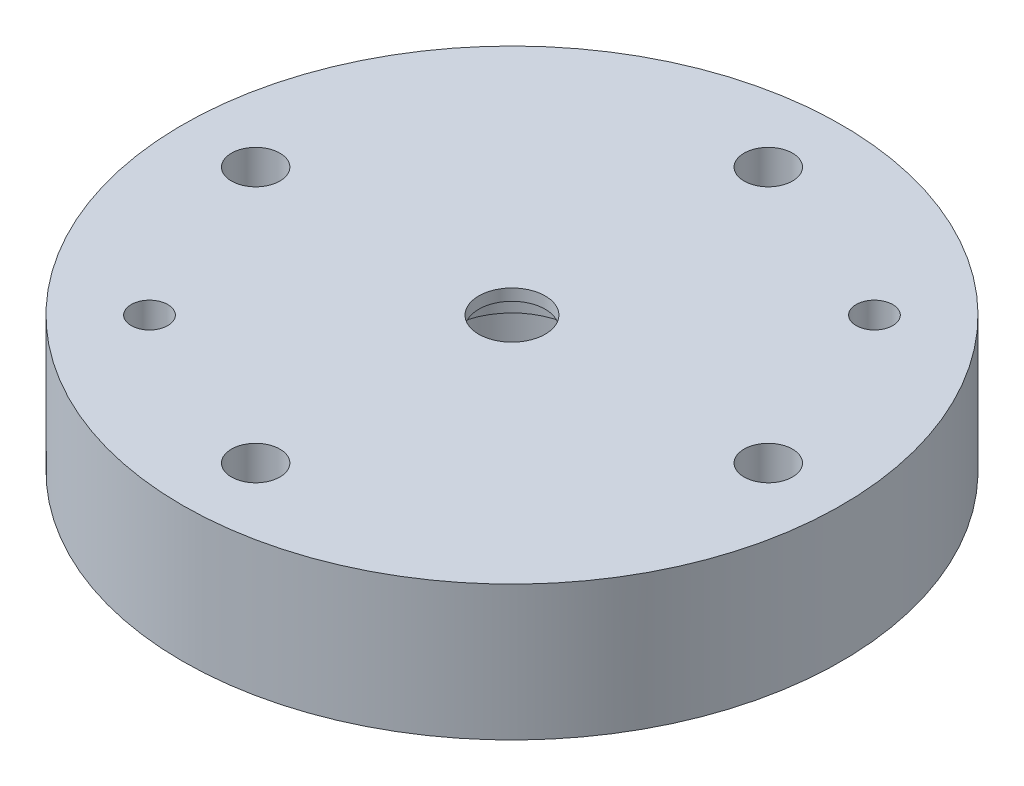
ISO-10303-21;
HEADER;
FILE_DESCRIPTION(('STEP AP214'),'2;1');
FILE_NAME('part.step','',(''),(''),'','','');
FILE_SCHEMA(('AUTOMOTIVE_DESIGN { 1 0 10303 214 1 1 1 1 }'));
ENDSEC;
DATA;
#1=APPLICATION_CONTEXT('core data for automotive mechanical design processes');
#2=APPLICATION_PROTOCOL_DEFINITION('international standard','automotive_design',2000,#1);
#3=PRODUCT_CONTEXT('',#1,'mechanical');
#4=PRODUCT('Part','Part','',(#3));
#5=PRODUCT_RELATED_PRODUCT_CATEGORY('part','',(#4));
#6=PRODUCT_DEFINITION_FORMATION('','',#4);
#7=PRODUCT_DEFINITION_CONTEXT('part definition',#1,'design');
#8=PRODUCT_DEFINITION('design','',#6,#7);
#9=PRODUCT_DEFINITION_SHAPE('','',#8);
#10=(LENGTH_UNIT() NAMED_UNIT(*) SI_UNIT(.MILLI.,.METRE.));
#11=(NAMED_UNIT(*) PLANE_ANGLE_UNIT() SI_UNIT($,.RADIAN.));
#12=(NAMED_UNIT(*) SI_UNIT($,.STERADIAN.) SOLID_ANGLE_UNIT());
#13=UNCERTAINTY_MEASURE_WITH_UNIT(LENGTH_MEASURE(1.E-05),#10,'distance_accuracy_value','');
#14=(GEOMETRIC_REPRESENTATION_CONTEXT(3) GLOBAL_UNCERTAINTY_ASSIGNED_CONTEXT((#13)) GLOBAL_UNIT_ASSIGNED_CONTEXT((#10,
#11,#12)) REPRESENTATION_CONTEXT('',''));
#15=CARTESIAN_POINT('',(0.,0.,0.));
#16=DIRECTION('',(0.,0.,1.));
#17=DIRECTION('',(1.,0.,0.));
#18=AXIS2_PLACEMENT_3D('',#15,#16,#17);
#19=CARTESIAN_POINT('',(0.,-5.5372,0.));
#20=DIRECTION('',(0.,1.,0.));
#21=DIRECTION('',(0.,0.,1.));
#22=AXIS2_PLACEMENT_3D('',#19,#20,#21);
#23=CYLINDRICAL_SURFACE('',#22,57.15);
#24=CARTESIAN_POINT('',(0.,-21.4122,0.));
#25=DIRECTION('',(0.,-1.,0.));
#26=DIRECTION('',(0.,0.,-1.));
#27=AXIS2_PLACEMENT_3D('',#24,#25,#26);
#28=CIRCLE('',#27,57.15);
#29=CARTESIAN_POINT('',(0.,-21.4122,-57.15));
#30=VERTEX_POINT('',#29);
#31=EDGE_CURVE('E12',#30,#30,#28,.T.);
#32=ORIENTED_EDGE('',*,*,#31,.F.);
#33=EDGE_LOOP('',(#32));
#34=FACE_BOUND('',#33,.T.);
#35=CARTESIAN_POINT('',(0.,2.,0.));
#36=DIRECTION('',(0.,1.,0.));
#37=DIRECTION('',(0.,0.,1.));
#38=AXIS2_PLACEMENT_3D('',#35,#36,#37);
#39=CIRCLE('',#38,57.15);
#40=CARTESIAN_POINT('',(0.,2.,57.15));
#41=VERTEX_POINT('',#40);
#42=EDGE_CURVE('E48',#41,#41,#39,.T.);
#43=ORIENTED_EDGE('',*,*,#42,.F.);
#44=EDGE_LOOP('',(#43));
#45=FACE_BOUND('',#44,.T.);
#46=ADVANCED_FACE('F42',(#34,#45),#23,.T.);
#47=CARTESIAN_POINT('',(0.,-21.4122,0.));
#48=DIRECTION('',(0.,-1.,0.));
#49=DIRECTION('',(0.,0.,-1.));
#50=AXIS2_PLACEMENT_3D('',#47,#48,#49);
#51=PLANE('',#50);
#52=CARTESIAN_POINT('',(0.,-21.4122,0.));
#53=DIRECTION('',(0.,-1.,0.));
#54=DIRECTION('',(0.,0.,-1.));
#55=AXIS2_PLACEMENT_3D('',#52,#53,#54);
#56=CIRCLE('',#55,12.7);
#57=CARTESIAN_POINT('',(0.,-21.4122,-12.7));
#58=VERTEX_POINT('',#57);
#59=EDGE_CURVE('E106',#58,#58,#56,.T.);
#60=ORIENTED_EDGE('',*,*,#59,.F.);
#61=EDGE_LOOP('',(#60));
#62=FACE_BOUND('',#61,.T.);
#63=CARTESIAN_POINT('',(31.430896423742,-21.4122,-31.4308964237421));
#64=DIRECTION('',(0.,1.,0.));
#65=DIRECTION('',(0.,0.,1.));
#66=AXIS2_PLACEMENT_3D('',#63,#64,#65);
#67=CIRCLE('',#66,3.175);
#68=CARTESIAN_POINT('',(31.430896423742,-21.4122,-28.2558964237421));
#69=VERTEX_POINT('',#68);
#70=EDGE_CURVE('E94',#69,#69,#67,.T.);
#71=ORIENTED_EDGE('',*,*,#70,.T.);
#72=EDGE_LOOP('',(#71));
#73=FACE_BOUND('',#72,.T.);
#74=CARTESIAN_POINT('',(-31.430896423742,-21.4122,31.4308964237421));
#75=DIRECTION('',(0.,1.,0.));
#76=DIRECTION('',(0.,0.,1.));
#77=AXIS2_PLACEMENT_3D('',#74,#75,#76);
#78=CIRCLE('',#77,3.17499999999999);
#79=CARTESIAN_POINT('',(-31.430896423742,-21.4122,34.6058964237421));
#80=VERTEX_POINT('',#79);
#81=EDGE_CURVE('E88',#80,#80,#78,.T.);
#82=ORIENTED_EDGE('',*,*,#81,.T.);
#83=EDGE_LOOP('',(#82));
#84=FACE_BOUND('',#83,.T.);
#85=CARTESIAN_POINT('',(-44.45,-21.4122,0.));
#86=DIRECTION('',(0.,1.,0.));
#87=DIRECTION('',(0.,0.,1.));
#88=AXIS2_PLACEMENT_3D('',#85,#86,#87);
#89=CIRCLE('',#88,4.2);
#90=CARTESIAN_POINT('',(-44.45,-21.4122,4.2));
#91=VERTEX_POINT('',#90);
#92=EDGE_CURVE('E82',#91,#91,#89,.T.);
#93=ORIENTED_EDGE('',*,*,#92,.T.);
#94=EDGE_LOOP('',(#93));
#95=FACE_BOUND('',#94,.T.);
#96=CARTESIAN_POINT('',(0.,-21.4122,-44.45));
#97=DIRECTION('',(0.,1.,0.));
#98=DIRECTION('',(0.,0.,1.));
#99=AXIS2_PLACEMENT_3D('',#96,#97,#98);
#100=CIRCLE('',#99,4.2);
#101=CARTESIAN_POINT('',(0.,-21.4122,-40.25));
#102=VERTEX_POINT('',#101);
#103=EDGE_CURVE('E76',#102,#102,#100,.T.);
#104=ORIENTED_EDGE('',*,*,#103,.T.);
#105=EDGE_LOOP('',(#104));
#106=FACE_BOUND('',#105,.T.);
#107=CARTESIAN_POINT('',(44.45,-21.4122,0.));
#108=DIRECTION('',(0.,1.,0.));
#109=DIRECTION('',(0.,0.,1.));
#110=AXIS2_PLACEMENT_3D('',#107,#108,#109);
#111=CIRCLE('',#110,4.2);
#112=CARTESIAN_POINT('',(44.45,-21.4122,4.2));
#113=VERTEX_POINT('',#112);
#114=EDGE_CURVE('E70',#113,#113,#111,.T.);
#115=ORIENTED_EDGE('',*,*,#114,.T.);
#116=EDGE_LOOP('',(#115));
#117=FACE_BOUND('',#116,.T.);
#118=CARTESIAN_POINT('',(0.,-21.4122,44.45));
#119=DIRECTION('',(0.,1.,0.));
#120=DIRECTION('',(0.,0.,1.));
#121=AXIS2_PLACEMENT_3D('',#118,#119,#120);
#122=CIRCLE('',#121,4.2);
#123=CARTESIAN_POINT('',(0.,-21.4122,48.65));
#124=VERTEX_POINT('',#123);
#125=EDGE_CURVE('E64',#124,#124,#122,.T.);
#126=ORIENTED_EDGE('',*,*,#125,.T.);
#127=EDGE_LOOP('',(#126));
#128=FACE_BOUND('',#127,.T.);
#129=ORIENTED_EDGE('',*,*,#31,.T.);
#130=EDGE_LOOP('',(#129));
#131=FACE_BOUND('',#130,.T.);
#132=ADVANCED_FACE('F113',(#62,#73,#84,#95,#106,#117,#128,#131),#51,.T.);
#133=CARTESIAN_POINT('',(0.,2.,0.));
#134=DIRECTION('',(0.,1.,0.));
#135=DIRECTION('',(0.,0.,1.));
#136=AXIS2_PLACEMENT_3D('',#133,#134,#135);
#137=PLANE('',#136);
#138=CARTESIAN_POINT('',(31.430896423742,2.,-31.4308964237421));
#139=DIRECTION('',(0.,1.,0.));
#140=DIRECTION('',(0.,0.,1.));
#141=AXIS2_PLACEMENT_3D('',#138,#139,#140);
#142=CIRCLE('',#141,3.175);
#143=CARTESIAN_POINT('',(31.430896423742,2.,-28.2558964237421));
#144=VERTEX_POINT('',#143);
#145=EDGE_CURVE('E97',#144,#144,#142,.T.);
#146=ORIENTED_EDGE('',*,*,#145,.F.);
#147=EDGE_LOOP('',(#146));
#148=FACE_BOUND('',#147,.T.);
#149=CARTESIAN_POINT('',(-31.430896423742,2.,31.4308964237421));
#150=DIRECTION('',(0.,1.,0.));
#151=DIRECTION('',(0.,0.,1.));
#152=AXIS2_PLACEMENT_3D('',#149,#150,#151);
#153=CIRCLE('',#152,3.175);
#154=CARTESIAN_POINT('',(-31.430896423742,2.,34.6058964237421));
#155=VERTEX_POINT('',#154);
#156=EDGE_CURVE('E91',#155,#155,#153,.T.);
#157=ORIENTED_EDGE('',*,*,#156,.F.);
#158=EDGE_LOOP('',(#157));
#159=FACE_BOUND('',#158,.T.);
#160=CARTESIAN_POINT('',(-44.45,2.,0.));
#161=DIRECTION('',(0.,1.,0.));
#162=DIRECTION('',(0.,0.,1.));
#163=AXIS2_PLACEMENT_3D('',#160,#161,#162);
#164=CIRCLE('',#163,4.2);
#165=CARTESIAN_POINT('',(-44.45,2.,4.2));
#166=VERTEX_POINT('',#165);
#167=EDGE_CURVE('E85',#166,#166,#164,.T.);
#168=ORIENTED_EDGE('',*,*,#167,.F.);
#169=EDGE_LOOP('',(#168));
#170=FACE_BOUND('',#169,.T.);
#171=CARTESIAN_POINT('',(0.,2.,-44.45));
#172=DIRECTION('',(0.,1.,0.));
#173=DIRECTION('',(0.,0.,1.));
#174=AXIS2_PLACEMENT_3D('',#171,#172,#173);
#175=CIRCLE('',#174,4.2);
#176=CARTESIAN_POINT('',(0.,2.,-40.25));
#177=VERTEX_POINT('',#176);
#178=EDGE_CURVE('E79',#177,#177,#175,.T.);
#179=ORIENTED_EDGE('',*,*,#178,.F.);
#180=EDGE_LOOP('',(#179));
#181=FACE_BOUND('',#180,.T.);
#182=CARTESIAN_POINT('',(44.45,2.,0.));
#183=DIRECTION('',(0.,1.,0.));
#184=DIRECTION('',(0.,0.,1.));
#185=AXIS2_PLACEMENT_3D('',#182,#183,#184);
#186=CIRCLE('',#185,4.2);
#187=CARTESIAN_POINT('',(44.45,2.,4.2));
#188=VERTEX_POINT('',#187);
#189=EDGE_CURVE('E73',#188,#188,#186,.T.);
#190=ORIENTED_EDGE('',*,*,#189,.F.);
#191=EDGE_LOOP('',(#190));
#192=FACE_BOUND('',#191,.T.);
#193=CARTESIAN_POINT('',(0.,2.,44.45));
#194=DIRECTION('',(0.,1.,0.));
#195=DIRECTION('',(0.,0.,1.));
#196=AXIS2_PLACEMENT_3D('',#193,#194,#195);
#197=CIRCLE('',#196,4.2);
#198=CARTESIAN_POINT('',(0.,2.,48.65));
#199=VERTEX_POINT('',#198);
#200=EDGE_CURVE('E67',#199,#199,#197,.T.);
#201=ORIENTED_EDGE('',*,*,#200,.F.);
#202=EDGE_LOOP('',(#201));
#203=FACE_BOUND('',#202,.T.);
#204=CARTESIAN_POINT('',(0.,2.,0.));
#205=DIRECTION('',(0.,1.,0.));
#206=DIRECTION('',(0.,0.,1.));
#207=AXIS2_PLACEMENT_3D('',#204,#205,#206);
#208=CIRCLE('',#207,5.7625);
#209=CARTESIAN_POINT('',(0.,2.,5.7625));
#210=VERTEX_POINT('',#209);
#211=EDGE_CURVE('E56',#210,#210,#208,.T.);
#212=ORIENTED_EDGE('',*,*,#211,.F.);
#213=EDGE_LOOP('',(#212));
#214=FACE_BOUND('',#213,.T.);
#215=ORIENTED_EDGE('',*,*,#42,.T.);
#216=EDGE_LOOP('',(#215));
#217=FACE_BOUND('',#216,.T.);
#218=ADVANCED_FACE('F116',(#148,#159,#170,#181,#192,#203,#214,#217),#137,.T.);
#219=CARTESIAN_POINT('',(0.,18.2988113063499,0.));
#220=DIRECTION('',(0.,-1.,0.));
#221=DIRECTION('',(0.,0.,-1.));
#222=AXIS2_PLACEMENT_3D('',#219,#220,#221);
#223=CYLINDRICAL_SURFACE('',#222,5.7625);
#224=CARTESIAN_POINT('',(0.,0.,0.));
#225=DIRECTION('',(0.,1.,0.));
#226=DIRECTION('',(0.,0.,1.));
#227=AXIS2_PLACEMENT_3D('',#224,#225,#226);
#228=CIRCLE('',#227,5.7625);
#229=CARTESIAN_POINT('',(0.,0.,5.7625));
#230=VERTEX_POINT('',#229);
#231=EDGE_CURVE('E61',#230,#230,#228,.T.);
#232=ORIENTED_EDGE('',*,*,#231,.F.);
#233=EDGE_LOOP('',(#232));
#234=FACE_BOUND('',#233,.T.);
#235=ORIENTED_EDGE('',*,*,#211,.T.);
#236=EDGE_LOOP('',(#235));
#237=FACE_BOUND('',#236,.T.);
#238=ADVANCED_FACE('F139',(#234,#237),#223,.F.);
#239=CARTESIAN_POINT('',(0.,-5.5372,0.));
#240=DIRECTION('',(0.,1.,0.));
#241=DIRECTION('',(0.,0.,1.));
#242=AXIS2_PLACEMENT_3D('',#239,#240,#241);
#243=CYLINDRICAL_SURFACE('',#242,11.1125);
#244=CARTESIAN_POINT('',(0.,-5.5372,0.));
#245=DIRECTION('',(0.,1.,0.));
#246=DIRECTION('',(0.,0.,1.));
#247=AXIS2_PLACEMENT_3D('',#244,#245,#246);
#248=CIRCLE('',#247,11.1125);
#249=CARTESIAN_POINT('',(0.,-5.5372,11.1125));
#250=VERTEX_POINT('',#249);
#251=EDGE_CURVE('E100',#250,#250,#248,.F.);
#252=ORIENTED_EDGE('',*,*,#251,.T.);
#253=EDGE_LOOP('',(#252));
#254=FACE_BOUND('',#253,.T.);
#255=CARTESIAN_POINT('',(0.,0.,0.));
#256=DIRECTION('',(0.,1.,0.));
#257=DIRECTION('',(0.,0.,1.));
#258=AXIS2_PLACEMENT_3D('',#255,#256,#257);
#259=CIRCLE('',#258,11.1125);
#260=CARTESIAN_POINT('',(0.,0.,11.1125));
#261=VERTEX_POINT('',#260);
#262=EDGE_CURVE('E52',#261,#261,#259,.T.);
#263=ORIENTED_EDGE('',*,*,#262,.T.);
#264=EDGE_LOOP('',(#263));
#265=FACE_BOUND('',#264,.T.);
#266=ADVANCED_FACE('F145',(#254,#265),#243,.F.);
#267=CARTESIAN_POINT('',(0.,0.,0.));
#268=DIRECTION('',(0.,1.,0.));
#269=DIRECTION('',(0.,0.,1.));
#270=AXIS2_PLACEMENT_3D('',#267,#268,#269);
#271=PLANE('',#270);
#272=ORIENTED_EDGE('',*,*,#231,.T.);
#273=EDGE_LOOP('',(#272));
#274=FACE_BOUND('',#273,.T.);
#275=ORIENTED_EDGE('',*,*,#262,.F.);
#276=EDGE_LOOP('',(#275));
#277=FACE_BOUND('',#276,.T.);
#278=ADVANCED_FACE('F133',(#274,#277),#271,.F.);
#279=CARTESIAN_POINT('',(0.,2.,44.45));
#280=DIRECTION('',(0.,1.,0.));
#281=DIRECTION('',(0.,0.,1.));
#282=AXIS2_PLACEMENT_3D('',#279,#280,#281);
#283=CYLINDRICAL_SURFACE('',#282,4.2);
#284=ORIENTED_EDGE('',*,*,#125,.F.);
#285=EDGE_LOOP('',(#284));
#286=FACE_BOUND('',#285,.T.);
#287=ORIENTED_EDGE('',*,*,#200,.T.);
#288=EDGE_LOOP('',(#287));
#289=FACE_BOUND('',#288,.T.);
#290=ADVANCED_FACE('F129',(#286,#289),#283,.F.);
#291=CARTESIAN_POINT('',(44.45,2.,0.));
#292=DIRECTION('',(0.,1.,0.));
#293=DIRECTION('',(0.,0.,1.));
#294=AXIS2_PLACEMENT_3D('',#291,#292,#293);
#295=CYLINDRICAL_SURFACE('',#294,4.2);
#296=ORIENTED_EDGE('',*,*,#114,.F.);
#297=EDGE_LOOP('',(#296));
#298=FACE_BOUND('',#297,.T.);
#299=ORIENTED_EDGE('',*,*,#189,.T.);
#300=EDGE_LOOP('',(#299));
#301=FACE_BOUND('',#300,.T.);
#302=ADVANCED_FACE('F132',(#298,#301),#295,.F.);
#303=CARTESIAN_POINT('',(0.,2.,-44.45));
#304=DIRECTION('',(0.,1.,0.));
#305=DIRECTION('',(0.,0.,1.));
#306=AXIS2_PLACEMENT_3D('',#303,#304,#305);
#307=CYLINDRICAL_SURFACE('',#306,4.2);
#308=ORIENTED_EDGE('',*,*,#103,.F.);
#309=EDGE_LOOP('',(#308));
#310=FACE_BOUND('',#309,.T.);
#311=ORIENTED_EDGE('',*,*,#178,.T.);
#312=EDGE_LOOP('',(#311));
#313=FACE_BOUND('',#312,.T.);
#314=ADVANCED_FACE('F220',(#310,#313),#307,.F.);
#315=CARTESIAN_POINT('',(-44.45,2.,0.));
#316=DIRECTION('',(0.,1.,0.));
#317=DIRECTION('',(0.,0.,1.));
#318=AXIS2_PLACEMENT_3D('',#315,#316,#317);
#319=CYLINDRICAL_SURFACE('',#318,4.2);
#320=ORIENTED_EDGE('',*,*,#92,.F.);
#321=EDGE_LOOP('',(#320));
#322=FACE_BOUND('',#321,.T.);
#323=ORIENTED_EDGE('',*,*,#167,.T.);
#324=EDGE_LOOP('',(#323));
#325=FACE_BOUND('',#324,.T.);
#326=ADVANCED_FACE('F178',(#322,#325),#319,.F.);
#327=CARTESIAN_POINT('',(-31.430896423742,2.,31.4308964237421));
#328=DIRECTION('',(0.,1.,0.));
#329=DIRECTION('',(0.,0.,1.));
#330=AXIS2_PLACEMENT_3D('',#327,#328,#329);
#331=CYLINDRICAL_SURFACE('',#330,3.175);
#332=ORIENTED_EDGE('',*,*,#81,.F.);
#333=EDGE_LOOP('',(#332));
#334=FACE_BOUND('',#333,.T.);
#335=ORIENTED_EDGE('',*,*,#156,.T.);
#336=EDGE_LOOP('',(#335));
#337=FACE_BOUND('',#336,.T.);
#338=ADVANCED_FACE('F183',(#334,#337),#331,.F.);
#339=CARTESIAN_POINT('',(31.430896423742,2.,-31.4308964237421));
#340=DIRECTION('',(0.,1.,0.));
#341=DIRECTION('',(0.,0.,1.));
#342=AXIS2_PLACEMENT_3D('',#339,#340,#341);
#343=CYLINDRICAL_SURFACE('',#342,3.175);
#344=ORIENTED_EDGE('',*,*,#70,.F.);
#345=EDGE_LOOP('',(#344));
#346=FACE_BOUND('',#345,.T.);
#347=ORIENTED_EDGE('',*,*,#145,.T.);
#348=EDGE_LOOP('',(#347));
#349=FACE_BOUND('',#348,.T.);
#350=ADVANCED_FACE('F187',(#346,#349),#343,.F.);
#351=CARTESIAN_POINT('',(0.,-5.5372,0.));
#352=DIRECTION('',(0.,1.,0.));
#353=DIRECTION('',(0.,0.,1.));
#354=AXIS2_PLACEMENT_3D('',#351,#352,#353);
#355=PLANE('',#354);
#356=CARTESIAN_POINT('',(0.,-5.5372,0.));
#357=DIRECTION('',(0.,1.,0.));
#358=DIRECTION('',(0.,0.,1.));
#359=AXIS2_PLACEMENT_3D('',#356,#357,#358);
#360=CIRCLE('',#359,12.7);
#361=CARTESIAN_POINT('',(0.,-5.53720000000001,-12.7));
#362=VERTEX_POINT('',#361);
#363=EDGE_CURVE('E103',#362,#362,#360,.F.);
#364=ORIENTED_EDGE('',*,*,#363,.T.);
#365=EDGE_LOOP('',(#364));
#366=FACE_BOUND('',#365,.T.);
#367=ORIENTED_EDGE('',*,*,#251,.F.);
#368=EDGE_LOOP('',(#367));
#369=FACE_BOUND('',#368,.T.);
#370=ADVANCED_FACE('F196',(#366,#369),#355,.F.);
#371=CARTESIAN_POINT('',(0.,30.3838244842766,0.));
#372=DIRECTION('',(0.,-1.,0.));
#373=DIRECTION('',(0.,0.,-1.));
#374=AXIS2_PLACEMENT_3D('',#371,#372,#373);
#375=CYLINDRICAL_SURFACE('',#374,12.7);
#376=CARTESIAN_POINT('',(0.,-21.4122,-12.7));
#377=CARTESIAN_POINT('',(0.,-21.2468354166667,-12.7));
#378=CARTESIAN_POINT('',(0.,-21.0814708333333,-12.7));
#379=CARTESIAN_POINT('',(0.,-20.7507416666667,-12.7));
#380=CARTESIAN_POINT('',(0.,-20.5853770833333,-12.7));
#381=CARTESIAN_POINT('',(0.,-20.2546479166667,-12.7));
#382=CARTESIAN_POINT('',(0.,-20.0892833333333,-12.7));
#383=CARTESIAN_POINT('',(0.,-19.7585541666667,-12.7));
#384=CARTESIAN_POINT('',(0.,-19.5931895833333,-12.7));
#385=CARTESIAN_POINT('',(0.,-19.2624604166667,-12.7));
#386=CARTESIAN_POINT('',(0.,-19.0970958333333,-12.7));
#387=CARTESIAN_POINT('',(0.,-18.7663666666667,-12.7));
#388=CARTESIAN_POINT('',(0.,-18.6010020833333,-12.7));
#389=CARTESIAN_POINT('',(0.,-18.2702729166667,-12.7));
#390=CARTESIAN_POINT('',(0.,-18.1049083333333,-12.7));
#391=CARTESIAN_POINT('',(0.,-17.7741791666667,-12.7));
#392=CARTESIAN_POINT('',(0.,-17.6088145833333,-12.7));
#393=CARTESIAN_POINT('',(0.,-17.2780854166667,-12.7));
#394=CARTESIAN_POINT('',(0.,-17.1127208333333,-12.7));
#395=CARTESIAN_POINT('',(0.,-16.7819916666667,-12.7));
#396=CARTESIAN_POINT('',(0.,-16.6166270833333,-12.7));
#397=CARTESIAN_POINT('',(0.,-16.2858979166667,-12.7));
#398=CARTESIAN_POINT('',(0.,-16.1205333333333,-12.7));
#399=CARTESIAN_POINT('',(0.,-15.7898041666667,-12.7));
#400=CARTESIAN_POINT('',(0.,-15.6244395833333,-12.7));
#401=CARTESIAN_POINT('',(0.,-15.2937104166667,-12.7));
#402=CARTESIAN_POINT('',(0.,-15.1283458333333,-12.7));
#403=CARTESIAN_POINT('',(0.,-14.7976166666667,-12.7));
#404=CARTESIAN_POINT('',(0.,-14.6322520833333,-12.7));
#405=CARTESIAN_POINT('',(0.,-14.3015229166667,-12.7));
#406=CARTESIAN_POINT('',(0.,-14.1361583333333,-12.7));
#407=CARTESIAN_POINT('',(0.,-13.8054291666667,-12.7));
#408=CARTESIAN_POINT('',(0.,-13.6400645833333,-12.7));
#409=CARTESIAN_POINT('',(0.,-13.3093354166667,-12.7));
#410=CARTESIAN_POINT('',(0.,-13.1439708333333,-12.7));
#411=CARTESIAN_POINT('',(0.,-12.8132416666667,-12.7));
#412=CARTESIAN_POINT('',(0.,-12.6478770833333,-12.7));
#413=CARTESIAN_POINT('',(0.,-12.3171479166667,-12.7));
#414=CARTESIAN_POINT('',(0.,-12.1517833333333,-12.7));
#415=CARTESIAN_POINT('',(0.,-11.8210541666667,-12.7));
#416=CARTESIAN_POINT('',(0.,-11.6556895833333,-12.7));
#417=CARTESIAN_POINT('',(0.,-11.3249604166667,-12.7));
#418=CARTESIAN_POINT('',(0.,-11.1595958333333,-12.7));
#419=CARTESIAN_POINT('',(0.,-10.8288666666667,-12.7));
#420=CARTESIAN_POINT('',(0.,-10.6635020833333,-12.7));
#421=CARTESIAN_POINT('',(0.,-10.3327729166667,-12.7));
#422=CARTESIAN_POINT('',(0.,-10.1674083333333,-12.7));
#423=CARTESIAN_POINT('',(0.,-9.83667916666667,-12.7));
#424=CARTESIAN_POINT('',(0.,-9.67131458333333,-12.7));
#425=CARTESIAN_POINT('',(0.,-9.34058541666667,-12.7));
#426=CARTESIAN_POINT('',(0.,-9.17522083333334,-12.7));
#427=CARTESIAN_POINT('',(0.,-8.84449166666667,-12.7));
#428=CARTESIAN_POINT('',(0.,-8.67912708333334,-12.7));
#429=CARTESIAN_POINT('',(0.,-8.34839791666667,-12.7));
#430=CARTESIAN_POINT('',(0.,-8.18303333333334,-12.7));
#431=CARTESIAN_POINT('',(0.,-7.85230416666667,-12.7));
#432=CARTESIAN_POINT('',(0.,-7.68693958333334,-12.7));
#433=CARTESIAN_POINT('',(0.,-7.35621041666667,-12.7));
#434=CARTESIAN_POINT('',(0.,-7.19084583333334,-12.7));
#435=CARTESIAN_POINT('',(0.,-6.86011666666667,-12.7));
#436=CARTESIAN_POINT('',(0.,-6.69475208333334,-12.7));
#437=CARTESIAN_POINT('',(0.,-6.36402291666667,-12.7));
#438=CARTESIAN_POINT('',(0.,-6.19865833333334,-12.7));
#439=CARTESIAN_POINT('',(0.,-5.86792916666667,-12.7));
#440=CARTESIAN_POINT('',(0.,-5.70256458333334,-12.7));
#441=CARTESIAN_POINT('',(0.,-5.53720000000001,-12.7));
#442=B_SPLINE_CURVE_WITH_KNOTS('',3,(#376,#377,#378,#379,#380,#381,#382,#383,#384,#385,#386,
#387,#388,#389,#390,#391,#392,#393,#394,#395,#396,#397,#398,#399,#400,#401,#402,#403,#404,#405,
#406,#407,#408,#409,#410,#411,#412,#413,#414,#415,#416,#417,#418,#419,#420,#421,#422,#423,#424,
#425,#426,#427,#428,#429,#430,#431,#432,#433,#434,#435,#436,#437,#438,#439,#440,#441),
.UNSPECIFIED.,.F.,.F.,(4,2,2,2,2,2,2,2,2,2,2,2,2,2,2,2,2,2,2,2,2,2,2,2,2,2,2,2,2,2,2,2,4),(0.,
0.496093750000003,0.992187499999998,1.48828125,1.984375,2.48046875,2.97656249999999,3.47265625,
3.96874999999999,4.46484375,4.9609375,5.45703124999999,5.953125,6.44921874999999,
6.94531249999999,7.44140624999999,7.93749999999999,8.43359375,8.92968749999999,9.42578124999999,
9.92187499999999,10.41796875,10.9140625,11.41015625,11.90625,12.40234375,12.8984375,13.39453125,
13.890625,14.38671875,14.8828125,15.37890625,15.875),.UNSPECIFIED.);
#443=EDGE_CURVE('BSEAM110',#58,#362,#442,.T.);
#444=ORIENTED_EDGE('',*,*,#59,.T.);
#445=ORIENTED_EDGE('',*,*,#363,.F.);
#446=ORIENTED_EDGE('',*,*,#443,.T.);
#447=ORIENTED_EDGE('',*,*,#443,.F.);
#448=EDGE_LOOP('',(#444,#446,#445,#447));
#449=FACE_BOUND('',#448,.T.);
#450=ADVANCED_FACE('F110',(#449),#375,.F.);
#451=CLOSED_SHELL('',(#46,#132,#218,#238,#266,#278,#290,#302,#314,#326,#338,#350,#370,#450));
#452=MANIFOLD_SOLID_BREP('B2',#451);
#453=ADVANCED_BREP_SHAPE_REPRESENTATION('',(#18,#452),#14);
#454=SHAPE_DEFINITION_REPRESENTATION(#9,#453);
ENDSEC;
END-ISO-10303-21;
